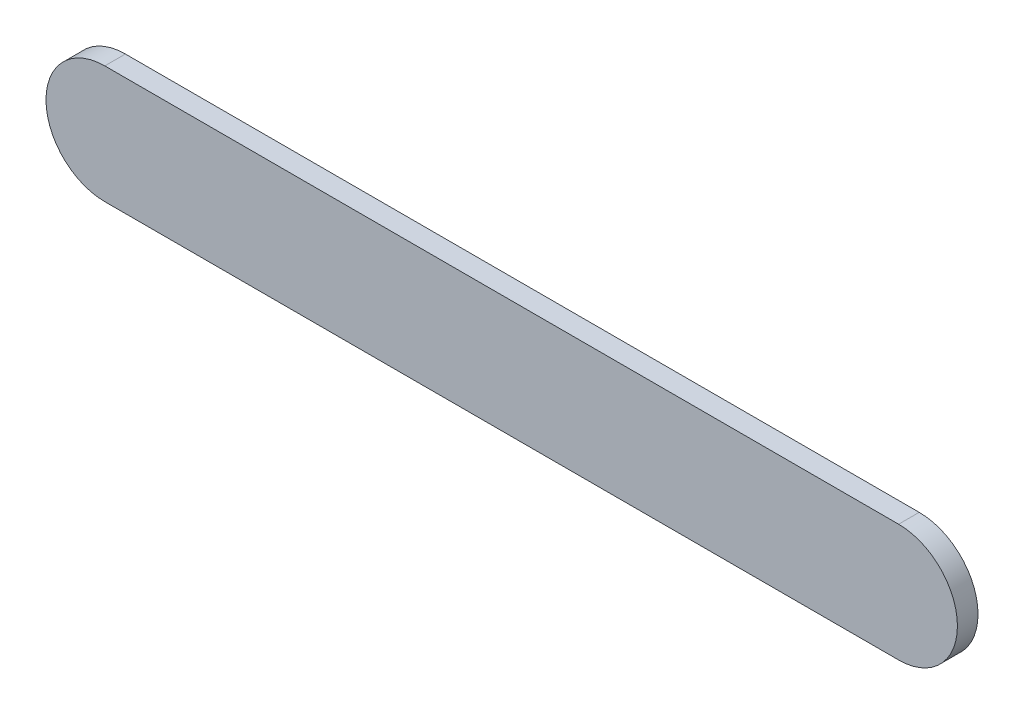
ISO-10303-21;
HEADER;
FILE_DESCRIPTION(('STEP AP214'),'2;1');
FILE_NAME('part.step','',(''),(''),'','','');
FILE_SCHEMA(('AUTOMOTIVE_DESIGN { 1 0 10303 214 1 1 1 1 }'));
ENDSEC;
DATA;
#1=APPLICATION_CONTEXT('core data for automotive mechanical design processes');
#2=APPLICATION_PROTOCOL_DEFINITION('international standard','automotive_design',2000,#1);
#3=PRODUCT_CONTEXT('',#1,'mechanical');
#4=PRODUCT('Part','Part','',(#3));
#5=PRODUCT_RELATED_PRODUCT_CATEGORY('part','',(#4));
#6=PRODUCT_DEFINITION_FORMATION('','',#4);
#7=PRODUCT_DEFINITION_CONTEXT('part definition',#1,'design');
#8=PRODUCT_DEFINITION('design','',#6,#7);
#9=PRODUCT_DEFINITION_SHAPE('','',#8);
#10=(LENGTH_UNIT() NAMED_UNIT(*) SI_UNIT(.MILLI.,.METRE.));
#11=(NAMED_UNIT(*) PLANE_ANGLE_UNIT() SI_UNIT($,.RADIAN.));
#12=(NAMED_UNIT(*) SI_UNIT($,.STERADIAN.) SOLID_ANGLE_UNIT());
#13=UNCERTAINTY_MEASURE_WITH_UNIT(LENGTH_MEASURE(1.E-05),#10,'distance_accuracy_value','');
#14=(GEOMETRIC_REPRESENTATION_CONTEXT(3) GLOBAL_UNCERTAINTY_ASSIGNED_CONTEXT((#13)) GLOBAL_UNIT_ASSIGNED_CONTEXT((#10,
#11,#12)) REPRESENTATION_CONTEXT('',''));
#15=CARTESIAN_POINT('',(0.,0.,0.));
#16=DIRECTION('',(0.,0.,1.));
#17=DIRECTION('',(1.,0.,0.));
#18=AXIS2_PLACEMENT_3D('',#15,#16,#17);
#19=CARTESIAN_POINT('',(78.3,-118.6,1.635));
#20=DIRECTION('',(0.,0.,1.));
#21=DIRECTION('',(1.,0.,0.));
#22=AXIS2_PLACEMENT_3D('',#19,#20,#21);
#23=PLANE('',#22);
#24=DIRECTION('',(1.,0.,0.));
#25=VECTOR('',#24,1.);
#26=CARTESIAN_POINT('',(78.3,-118.6,1.635));
#27=LINE('',#26,#25);
#28=CARTESIAN_POINT('',(78.3,-118.6,1.635));
#29=VERTEX_POINT('',#28);
#30=CARTESIAN_POINT('',(79.65,-118.6,1.635));
#31=VERTEX_POINT('',#30);
#32=EDGE_CURVE('E73',#29,#31,#27,.T.);
#33=ORIENTED_EDGE('',*,*,#32,.T.);
#34=CARTESIAN_POINT('',(79.65,-118.5,1.635));
#35=DIRECTION('',(0.,0.,1.));
#36=DIRECTION('',(0.,-1.,0.));
#37=AXIS2_PLACEMENT_3D('',#34,#35,#36);
#38=CIRCLE('',#37,0.09999999999999);
#39=CARTESIAN_POINT('',(79.65,-118.4,1.635));
#40=VERTEX_POINT('',#39);
#41=EDGE_CURVE('E71',#31,#40,#38,.T.);
#42=ORIENTED_EDGE('',*,*,#41,.T.);
#43=DIRECTION('',(-1.,0.,0.));
#44=VECTOR('',#43,1.);
#45=CARTESIAN_POINT('',(79.65,-118.4,1.635));
#46=LINE('',#45,#44);
#47=CARTESIAN_POINT('',(78.3,-118.4,1.635));
#48=VERTEX_POINT('',#47);
#49=EDGE_CURVE('E58',#40,#48,#46,.T.);
#50=ORIENTED_EDGE('',*,*,#49,.T.);
#51=CARTESIAN_POINT('',(78.3,-118.5,1.635));
#52=DIRECTION('',(0.,0.,1.));
#53=DIRECTION('',(0.,1.,0.));
#54=AXIS2_PLACEMENT_3D('',#51,#52,#53);
#55=CIRCLE('',#54,0.09999999999999);
#56=EDGE_CURVE('E11',#48,#29,#55,.T.);
#57=ORIENTED_EDGE('',*,*,#56,.T.);
#58=EDGE_LOOP('',(#33,#42,#50,#57));
#59=FACE_BOUND('',#58,.T.);
#60=ADVANCED_FACE('F17',(#59),#23,.T.);
#61=CARTESIAN_POINT('',(78.3,-118.6,1.6));
#62=DIRECTION('',(0.,0.,1.));
#63=DIRECTION('',(1.,0.,0.));
#64=AXIS2_PLACEMENT_3D('',#61,#62,#63);
#65=PLANE('',#64);
#66=CARTESIAN_POINT('',(78.3,-118.5,1.6));
#67=DIRECTION('',(0.,0.,1.));
#68=DIRECTION('',(0.,1.,0.));
#69=AXIS2_PLACEMENT_3D('',#66,#67,#68);
#70=CIRCLE('',#69,0.09999999999999);
#71=CARTESIAN_POINT('',(78.3,-118.4,1.6));
#72=VERTEX_POINT('',#71);
#73=CARTESIAN_POINT('',(78.3,-118.6,1.6));
#74=VERTEX_POINT('',#73);
#75=EDGE_CURVE('E21',#72,#74,#70,.T.);
#76=ORIENTED_EDGE('',*,*,#75,.F.);
#77=DIRECTION('',(-1.,0.,0.));
#78=VECTOR('',#77,1.);
#79=CARTESIAN_POINT('',(79.65,-118.4,1.6));
#80=LINE('',#79,#78);
#81=CARTESIAN_POINT('',(79.65,-118.4,1.6));
#82=VERTEX_POINT('',#81);
#83=EDGE_CURVE('E78',#82,#72,#80,.T.);
#84=ORIENTED_EDGE('',*,*,#83,.F.);
#85=CARTESIAN_POINT('',(79.65,-118.5,1.6));
#86=DIRECTION('',(0.,0.,1.));
#87=DIRECTION('',(0.,-1.,0.));
#88=AXIS2_PLACEMENT_3D('',#85,#86,#87);
#89=CIRCLE('',#88,0.09999999999999);
#90=CARTESIAN_POINT('',(79.65,-118.6,1.6));
#91=VERTEX_POINT('',#90);
#92=EDGE_CURVE('E82',#91,#82,#89,.T.);
#93=ORIENTED_EDGE('',*,*,#92,.F.);
#94=DIRECTION('',(1.,0.,0.));
#95=VECTOR('',#94,1.);
#96=CARTESIAN_POINT('',(78.3,-118.6,1.6));
#97=LINE('',#96,#95);
#98=EDGE_CURVE('E133',#74,#91,#97,.T.);
#99=ORIENTED_EDGE('',*,*,#98,.F.);
#100=EDGE_LOOP('',(#76,#84,#93,#99));
#101=FACE_BOUND('',#100,.T.);
#102=ADVANCED_FACE('F19',(#101),#65,.F.);
#103=CARTESIAN_POINT('',(78.3,-118.5,1.6));
#104=DIRECTION('',(0.,0.,-1.));
#105=DIRECTION('',(0.,1.,0.));
#106=AXIS2_PLACEMENT_3D('',#103,#104,#105);
#107=CYLINDRICAL_SURFACE('',#106,0.09999999999999);
#108=ORIENTED_EDGE('',*,*,#75,.T.);
#109=DIRECTION('',(0.,0.,1.));
#110=VECTOR('',#109,1.);
#111=CARTESIAN_POINT('',(78.3,-118.6,1.6));
#112=LINE('',#111,#110);
#113=EDGE_CURVE('E89',#74,#29,#112,.T.);
#114=ORIENTED_EDGE('',*,*,#113,.T.);
#115=ORIENTED_EDGE('',*,*,#56,.F.);
#116=DIRECTION('',(0.,0.,1.));
#117=VECTOR('',#116,1.);
#118=CARTESIAN_POINT('',(78.3,-118.4,1.6));
#119=LINE('',#118,#117);
#120=EDGE_CURVE('E65',#72,#48,#119,.T.);
#121=ORIENTED_EDGE('',*,*,#120,.F.);
#122=EDGE_LOOP('',(#108,#114,#115,#121));
#123=FACE_BOUND('',#122,.T.);
#124=ADVANCED_FACE('F154',(#123),#107,.T.);
#125=CARTESIAN_POINT('',(79.65,-118.4,1.6));
#126=DIRECTION('',(0.,-1.,0.));
#127=DIRECTION('',(0.,0.,-1.));
#128=AXIS2_PLACEMENT_3D('',#125,#126,#127);
#129=PLANE('',#128);
#130=ORIENTED_EDGE('',*,*,#83,.T.);
#131=ORIENTED_EDGE('',*,*,#120,.T.);
#132=ORIENTED_EDGE('',*,*,#49,.F.);
#133=DIRECTION('',(0.,0.,1.));
#134=VECTOR('',#133,1.);
#135=CARTESIAN_POINT('',(79.65,-118.4,1.6));
#136=LINE('',#135,#134);
#137=EDGE_CURVE('E63',#82,#40,#136,.T.);
#138=ORIENTED_EDGE('',*,*,#137,.F.);
#139=EDGE_LOOP('',(#130,#131,#132,#138));
#140=FACE_BOUND('',#139,.T.);
#141=ADVANCED_FACE('F61',(#140),#129,.F.);
#142=CARTESIAN_POINT('',(79.65,-118.5,1.6));
#143=DIRECTION('',(0.,0.,-1.));
#144=DIRECTION('',(0.,-1.,0.));
#145=AXIS2_PLACEMENT_3D('',#142,#143,#144);
#146=CYLINDRICAL_SURFACE('',#145,0.09999999999999);
#147=ORIENTED_EDGE('',*,*,#92,.T.);
#148=ORIENTED_EDGE('',*,*,#137,.T.);
#149=ORIENTED_EDGE('',*,*,#41,.F.);
#150=DIRECTION('',(0.,0.,1.));
#151=VECTOR('',#150,1.);
#152=CARTESIAN_POINT('',(79.65,-118.6,1.6));
#153=LINE('',#152,#151);
#154=EDGE_CURVE('E127',#91,#31,#153,.T.);
#155=ORIENTED_EDGE('',*,*,#154,.F.);
#156=EDGE_LOOP('',(#147,#148,#149,#155));
#157=FACE_BOUND('',#156,.T.);
#158=ADVANCED_FACE('F80',(#157),#146,.T.);
#159=CARTESIAN_POINT('',(78.3,-118.6,1.6));
#160=DIRECTION('',(0.,1.,0.));
#161=DIRECTION('',(1.,0.,0.));
#162=AXIS2_PLACEMENT_3D('',#159,#160,#161);
#163=PLANE('',#162);
#164=ORIENTED_EDGE('',*,*,#98,.T.);
#165=ORIENTED_EDGE('',*,*,#154,.T.);
#166=ORIENTED_EDGE('',*,*,#32,.F.);
#167=ORIENTED_EDGE('',*,*,#113,.F.);
#168=EDGE_LOOP('',(#164,#165,#166,#167));
#169=FACE_BOUND('',#168,.T.);
#170=ADVANCED_FACE('F145',(#169),#163,.F.);
#171=CLOSED_SHELL('',(#60,#102,#124,#141,#158,#170));
#172=MANIFOLD_SOLID_BREP('B1',#171);
#173=ADVANCED_BREP_SHAPE_REPRESENTATION('',(#18,#172),#14);
#174=SHAPE_DEFINITION_REPRESENTATION(#9,#173);
ENDSEC;
END-ISO-10303-21;
